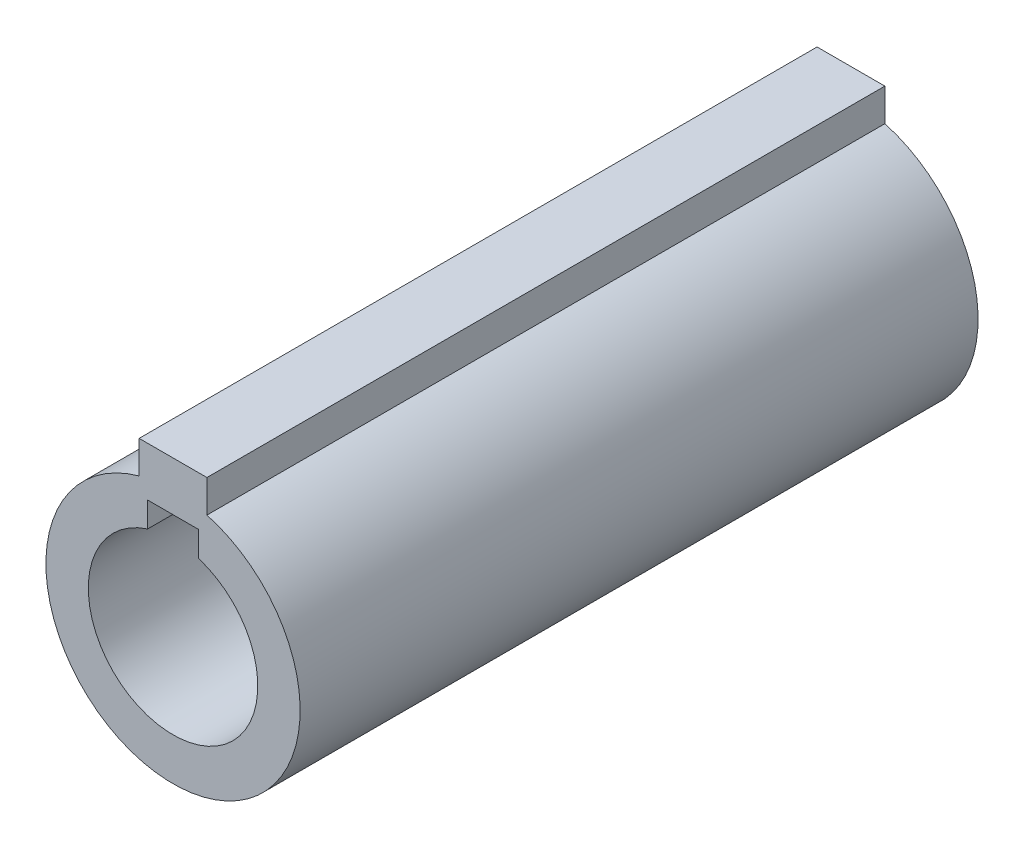
ISO-10303-21;
HEADER;
FILE_DESCRIPTION(('STEP AP214'),'2;1');
FILE_NAME('part.step','',(''),(''),'','','');
FILE_SCHEMA(('AUTOMOTIVE_DESIGN { 1 0 10303 214 1 1 1 1 }'));
ENDSEC;
DATA;
#1=APPLICATION_CONTEXT('core data for automotive mechanical design processes');
#2=APPLICATION_PROTOCOL_DEFINITION('international standard','automotive_design',2000,#1);
#3=PRODUCT_CONTEXT('',#1,'mechanical');
#4=PRODUCT('Part','Part','',(#3));
#5=PRODUCT_RELATED_PRODUCT_CATEGORY('part','',(#4));
#6=PRODUCT_DEFINITION_FORMATION('','',#4);
#7=PRODUCT_DEFINITION_CONTEXT('part definition',#1,'design');
#8=PRODUCT_DEFINITION('design','',#6,#7);
#9=PRODUCT_DEFINITION_SHAPE('','',#8);
#10=(LENGTH_UNIT() NAMED_UNIT(*) SI_UNIT(.MILLI.,.METRE.));
#11=(NAMED_UNIT(*) PLANE_ANGLE_UNIT() SI_UNIT($,.RADIAN.));
#12=(NAMED_UNIT(*) SI_UNIT($,.STERADIAN.) SOLID_ANGLE_UNIT());
#13=UNCERTAINTY_MEASURE_WITH_UNIT(LENGTH_MEASURE(1.E-05),#10,'distance_accuracy_value','');
#14=(GEOMETRIC_REPRESENTATION_CONTEXT(3) GLOBAL_UNCERTAINTY_ASSIGNED_CONTEXT((#13)) GLOBAL_UNIT_ASSIGNED_CONTEXT((#10,
#11,#12)) REPRESENTATION_CONTEXT('',''));
#15=CARTESIAN_POINT('',(0.,0.,0.));
#16=DIRECTION('',(0.,0.,1.));
#17=DIRECTION('',(1.,0.,0.));
#18=AXIS2_PLACEMENT_3D('',#15,#16,#17);
#19=CARTESIAN_POINT('',(0.,0.,80.));
#20=DIRECTION('',(0.,0.,1.));
#21=DIRECTION('',(1.,0.,0.));
#22=AXIS2_PLACEMENT_3D('',#19,#20,#21);
#23=PLANE('',#22);
#24=DIRECTION('',(-1.,0.,0.));
#25=VECTOR('',#24,1.);
#26=CARTESIAN_POINT('',(-4.,18.3,80.));
#27=LINE('',#26,#25);
#28=CARTESIAN_POINT('',(4.,18.3,80.));
#29=VERTEX_POINT('',#28);
#30=CARTESIAN_POINT('',(-4.,18.3,80.));
#31=VERTEX_POINT('',#30);
#32=EDGE_CURVE('E136',#29,#31,#27,.T.);
#33=ORIENTED_EDGE('',*,*,#32,.T.);
#34=DIRECTION('',(0.,-1.,0.));
#35=VECTOR('',#34,1.);
#36=CARTESIAN_POINT('',(-4.,18.3,80.));
#37=LINE('',#36,#35);
#38=CARTESIAN_POINT('',(-4.,14.456832294801,80.));
#39=VERTEX_POINT('',#38);
#40=EDGE_CURVE('E139',#31,#39,#37,.T.);
#41=ORIENTED_EDGE('',*,*,#40,.T.);
#42=CARTESIAN_POINT('',(0.,0.,80.));
#43=DIRECTION('',(0.,0.,1.));
#44=DIRECTION('',(1.,0.,0.));
#45=AXIS2_PLACEMENT_3D('',#42,#43,#44);
#46=CIRCLE('',#45,15.);
#47=CARTESIAN_POINT('',(4.,14.456832294801,80.));
#48=VERTEX_POINT('',#47);
#49=EDGE_CURVE('E142',#39,#48,#46,.T.);
#50=ORIENTED_EDGE('',*,*,#49,.T.);
#51=DIRECTION('',(0.,1.,0.));
#52=VECTOR('',#51,1.);
#53=CARTESIAN_POINT('',(4.,18.3,80.));
#54=LINE('',#53,#52);
#55=EDGE_CURVE('E144',#48,#29,#54,.T.);
#56=ORIENTED_EDGE('',*,*,#55,.T.);
#57=EDGE_LOOP('',(#33,#41,#50,#56));
#58=FACE_BOUND('',#57,.T.);
#59=DIRECTION('',(0.,1.,0.));
#60=VECTOR('',#59,1.);
#61=CARTESIAN_POINT('',(3.,12.5,80.));
#62=LINE('',#61,#60);
#63=CARTESIAN_POINT('',(3.,9.53939201416946,80.));
#64=VERTEX_POINT('',#63);
#65=CARTESIAN_POINT('',(3.,12.5,80.));
#66=VERTEX_POINT('',#65);
#67=EDGE_CURVE('E108',#64,#66,#62,.T.);
#68=ORIENTED_EDGE('',*,*,#67,.F.);
#69=CARTESIAN_POINT('',(0.,0.,80.));
#70=DIRECTION('',(0.,0.,1.));
#71=DIRECTION('',(1.,0.,0.));
#72=AXIS2_PLACEMENT_3D('',#69,#70,#71);
#73=CIRCLE('',#72,10.);
#74=CARTESIAN_POINT('',(-3.,9.53939201416946,80.));
#75=VERTEX_POINT('',#74);
#76=EDGE_CURVE('E100',#75,#64,#73,.T.);
#77=ORIENTED_EDGE('',*,*,#76,.F.);
#78=DIRECTION('',(0.,-1.,0.));
#79=VECTOR('',#78,1.);
#80=CARTESIAN_POINT('',(-3.,9.53939201416946,80.));
#81=LINE('',#80,#79);
#82=CARTESIAN_POINT('',(-3.,12.5,80.));
#83=VERTEX_POINT('',#82);
#84=EDGE_CURVE('E122',#83,#75,#81,.T.);
#85=ORIENTED_EDGE('',*,*,#84,.F.);
#86=DIRECTION('',(-1.,0.,0.));
#87=VECTOR('',#86,1.);
#88=CARTESIAN_POINT('',(-3.,12.5,80.));
#89=LINE('',#88,#87);
#90=EDGE_CURVE('E120',#66,#83,#89,.T.);
#91=ORIENTED_EDGE('',*,*,#90,.F.);
#92=EDGE_LOOP('',(#68,#77,#85,#91));
#93=FACE_BOUND('',#92,.T.);
#94=ADVANCED_FACE('F35',(#58,#93),#23,.T.);
#95=CARTESIAN_POINT('',(0.,0.,0.));
#96=DIRECTION('',(0.,0.,1.));
#97=DIRECTION('',(1.,0.,0.));
#98=AXIS2_PLACEMENT_3D('',#95,#96,#97);
#99=PLANE('',#98);
#100=DIRECTION('',(-1.,0.,0.));
#101=VECTOR('',#100,1.);
#102=CARTESIAN_POINT('',(-4.,18.3,0.));
#103=LINE('',#102,#101);
#104=CARTESIAN_POINT('',(4.,18.3,0.));
#105=VERTEX_POINT('',#104);
#106=CARTESIAN_POINT('',(-4.,18.3,0.));
#107=VERTEX_POINT('',#106);
#108=EDGE_CURVE('E116',#105,#107,#103,.T.);
#109=ORIENTED_EDGE('',*,*,#108,.F.);
#110=DIRECTION('',(0.,1.,0.));
#111=VECTOR('',#110,1.);
#112=CARTESIAN_POINT('',(4.,18.3,0.));
#113=LINE('',#112,#111);
#114=CARTESIAN_POINT('',(4.,14.456832294801,0.));
#115=VERTEX_POINT('',#114);
#116=EDGE_CURVE('E140',#115,#105,#113,.T.);
#117=ORIENTED_EDGE('',*,*,#116,.F.);
#118=CARTESIAN_POINT('',(0.,0.,0.));
#119=DIRECTION('',(0.,0.,1.));
#120=DIRECTION('',(1.,0.,0.));
#121=AXIS2_PLACEMENT_3D('',#118,#119,#120);
#122=CIRCLE('',#121,15.);
#123=CARTESIAN_POINT('',(-4.,14.456832294801,0.));
#124=VERTEX_POINT('',#123);
#125=EDGE_CURVE('E151',#124,#115,#122,.T.);
#126=ORIENTED_EDGE('',*,*,#125,.F.);
#127=DIRECTION('',(0.,-1.,0.));
#128=VECTOR('',#127,1.);
#129=CARTESIAN_POINT('',(-4.,18.3,0.));
#130=LINE('',#129,#128);
#131=EDGE_CURVE('E149',#107,#124,#130,.T.);
#132=ORIENTED_EDGE('',*,*,#131,.F.);
#133=EDGE_LOOP('',(#109,#117,#126,#132));
#134=FACE_BOUND('',#133,.T.);
#135=CARTESIAN_POINT('',(0.,0.,0.));
#136=DIRECTION('',(0.,0.,1.));
#137=DIRECTION('',(1.,0.,0.));
#138=AXIS2_PLACEMENT_3D('',#135,#136,#137);
#139=CIRCLE('',#138,10.);
#140=CARTESIAN_POINT('',(-3.,9.53939201416946,0.));
#141=VERTEX_POINT('',#140);
#142=CARTESIAN_POINT('',(3.,9.53939201416946,0.));
#143=VERTEX_POINT('',#142);
#144=EDGE_CURVE('E58',#141,#143,#139,.T.);
#145=ORIENTED_EDGE('',*,*,#144,.T.);
#146=DIRECTION('',(0.,1.,0.));
#147=VECTOR('',#146,1.);
#148=CARTESIAN_POINT('',(3.,12.5,0.));
#149=LINE('',#148,#147);
#150=CARTESIAN_POINT('',(3.,12.5,0.));
#151=VERTEX_POINT('',#150);
#152=EDGE_CURVE('E115',#143,#151,#149,.T.);
#153=ORIENTED_EDGE('',*,*,#152,.T.);
#154=DIRECTION('',(-1.,0.,0.));
#155=VECTOR('',#154,1.);
#156=CARTESIAN_POINT('',(-3.,12.5,0.));
#157=LINE('',#156,#155);
#158=CARTESIAN_POINT('',(-3.,12.5,0.));
#159=VERTEX_POINT('',#158);
#160=EDGE_CURVE('E128',#151,#159,#157,.T.);
#161=ORIENTED_EDGE('',*,*,#160,.T.);
#162=DIRECTION('',(0.,-1.,0.));
#163=VECTOR('',#162,1.);
#164=CARTESIAN_POINT('',(-3.,9.53939201416946,0.));
#165=LINE('',#164,#163);
#166=EDGE_CURVE('E109',#159,#141,#165,.T.);
#167=ORIENTED_EDGE('',*,*,#166,.T.);
#168=EDGE_LOOP('',(#145,#153,#161,#167));
#169=FACE_BOUND('',#168,.T.);
#170=ADVANCED_FACE('F169',(#134,#169),#99,.F.);
#171=CARTESIAN_POINT('',(-4.,18.3,80.));
#172=DIRECTION('',(0.,-1.,0.));
#173=DIRECTION('',(0.,0.,-1.));
#174=AXIS2_PLACEMENT_3D('',#171,#172,#173);
#175=PLANE('',#174);
#176=ORIENTED_EDGE('',*,*,#108,.T.);
#177=DIRECTION('',(0.,0.,-1.));
#178=VECTOR('',#177,1.);
#179=CARTESIAN_POINT('',(-4.,18.3,80.));
#180=LINE('',#179,#178);
#181=EDGE_CURVE('E11',#31,#107,#180,.T.);
#182=ORIENTED_EDGE('',*,*,#181,.F.);
#183=ORIENTED_EDGE('',*,*,#32,.F.);
#184=DIRECTION('',(0.,0.,-1.));
#185=VECTOR('',#184,1.);
#186=CARTESIAN_POINT('',(4.,18.3,80.));
#187=LINE('',#186,#185);
#188=EDGE_CURVE('E146',#29,#105,#187,.T.);
#189=ORIENTED_EDGE('',*,*,#188,.T.);
#190=EDGE_LOOP('',(#176,#182,#183,#189));
#191=FACE_BOUND('',#190,.T.);
#192=ADVANCED_FACE('F37',(#191),#175,.F.);
#193=CARTESIAN_POINT('',(-4.,18.3,80.));
#194=DIRECTION('',(1.,0.,0.));
#195=DIRECTION('',(0.,1.,0.));
#196=AXIS2_PLACEMENT_3D('',#193,#194,#195);
#197=PLANE('',#196);
#198=ORIENTED_EDGE('',*,*,#131,.T.);
#199=DIRECTION('',(0.,0.,-1.));
#200=VECTOR('',#199,1.);
#201=CARTESIAN_POINT('',(-4.,14.456832294801,80.));
#202=LINE('',#201,#200);
#203=EDGE_CURVE('E43',#39,#124,#202,.T.);
#204=ORIENTED_EDGE('',*,*,#203,.F.);
#205=ORIENTED_EDGE('',*,*,#40,.F.);
#206=ORIENTED_EDGE('',*,*,#181,.T.);
#207=EDGE_LOOP('',(#198,#204,#205,#206));
#208=FACE_BOUND('',#207,.T.);
#209=ADVANCED_FACE('F179',(#208),#197,.F.);
#210=CARTESIAN_POINT('',(0.,0.,80.));
#211=DIRECTION('',(0.,0.,-1.));
#212=DIRECTION('',(-1.,0.,0.));
#213=AXIS2_PLACEMENT_3D('',#210,#211,#212);
#214=CYLINDRICAL_SURFACE('',#213,15.);
#215=ORIENTED_EDGE('',*,*,#125,.T.);
#216=DIRECTION('',(0.,0.,-1.));
#217=VECTOR('',#216,1.);
#218=CARTESIAN_POINT('',(4.,14.456832294801,80.));
#219=LINE('',#218,#217);
#220=EDGE_CURVE('E156',#48,#115,#219,.T.);
#221=ORIENTED_EDGE('',*,*,#220,.F.);
#222=ORIENTED_EDGE('',*,*,#49,.F.);
#223=ORIENTED_EDGE('',*,*,#203,.T.);
#224=EDGE_LOOP('',(#215,#221,#222,#223));
#225=FACE_BOUND('',#224,.T.);
#226=ADVANCED_FACE('F163',(#225),#214,.T.);
#227=CARTESIAN_POINT('',(4.,18.3,80.));
#228=DIRECTION('',(-1.,0.,0.));
#229=DIRECTION('',(0.,-1.,0.));
#230=AXIS2_PLACEMENT_3D('',#227,#228,#229);
#231=PLANE('',#230);
#232=ORIENTED_EDGE('',*,*,#116,.T.);
#233=ORIENTED_EDGE('',*,*,#188,.F.);
#234=ORIENTED_EDGE('',*,*,#55,.F.);
#235=ORIENTED_EDGE('',*,*,#220,.T.);
#236=EDGE_LOOP('',(#232,#233,#234,#235));
#237=FACE_BOUND('',#236,.T.);
#238=ADVANCED_FACE('F173',(#237),#231,.F.);
#239=CARTESIAN_POINT('',(0.,0.,80.));
#240=DIRECTION('',(0.,0.,-1.));
#241=DIRECTION('',(-1.,0.,0.));
#242=AXIS2_PLACEMENT_3D('',#239,#240,#241);
#243=CYLINDRICAL_SURFACE('',#242,10.);
#244=ORIENTED_EDGE('',*,*,#144,.F.);
#245=DIRECTION('',(0.,0.,-1.));
#246=VECTOR('',#245,1.);
#247=CARTESIAN_POINT('',(-3.,9.53939201416946,80.));
#248=LINE('',#247,#246);
#249=EDGE_CURVE('E104',#75,#141,#248,.T.);
#250=ORIENTED_EDGE('',*,*,#249,.F.);
#251=ORIENTED_EDGE('',*,*,#76,.T.);
#252=DIRECTION('',(0.,0.,-1.));
#253=VECTOR('',#252,1.);
#254=CARTESIAN_POINT('',(3.,9.53939201416946,80.));
#255=LINE('',#254,#253);
#256=EDGE_CURVE('E103',#64,#143,#255,.T.);
#257=ORIENTED_EDGE('',*,*,#256,.T.);
#258=EDGE_LOOP('',(#244,#250,#251,#257));
#259=FACE_BOUND('',#258,.T.);
#260=ADVANCED_FACE('F102',(#259),#243,.F.);
#261=CARTESIAN_POINT('',(3.,12.5,80.));
#262=DIRECTION('',(-1.,0.,0.));
#263=DIRECTION('',(0.,0.,1.));
#264=AXIS2_PLACEMENT_3D('',#261,#262,#263);
#265=PLANE('',#264);
#266=ORIENTED_EDGE('',*,*,#152,.F.);
#267=ORIENTED_EDGE('',*,*,#256,.F.);
#268=ORIENTED_EDGE('',*,*,#67,.T.);
#269=DIRECTION('',(0.,0.,-1.));
#270=VECTOR('',#269,1.);
#271=CARTESIAN_POINT('',(3.,12.5,80.));
#272=LINE('',#271,#270);
#273=EDGE_CURVE('E117',#66,#151,#272,.T.);
#274=ORIENTED_EDGE('',*,*,#273,.T.);
#275=EDGE_LOOP('',(#266,#267,#268,#274));
#276=FACE_BOUND('',#275,.T.);
#277=ADVANCED_FACE('F112',(#276),#265,.T.);
#278=CARTESIAN_POINT('',(-3.,12.5,80.));
#279=DIRECTION('',(0.,-1.,0.));
#280=DIRECTION('',(0.,0.,-1.));
#281=AXIS2_PLACEMENT_3D('',#278,#279,#280);
#282=PLANE('',#281);
#283=ORIENTED_EDGE('',*,*,#160,.F.);
#284=ORIENTED_EDGE('',*,*,#273,.F.);
#285=ORIENTED_EDGE('',*,*,#90,.T.);
#286=DIRECTION('',(0.,0.,-1.));
#287=VECTOR('',#286,1.);
#288=CARTESIAN_POINT('',(-3.,12.5,80.));
#289=LINE('',#288,#287);
#290=EDGE_CURVE('E50',#83,#159,#289,.T.);
#291=ORIENTED_EDGE('',*,*,#290,.T.);
#292=EDGE_LOOP('',(#283,#284,#285,#291));
#293=FACE_BOUND('',#292,.T.);
#294=ADVANCED_FACE('F202',(#293),#282,.T.);
#295=CARTESIAN_POINT('',(-3.,9.53939201416946,80.));
#296=DIRECTION('',(1.,0.,0.));
#297=DIRECTION('',(0.,1.,0.));
#298=AXIS2_PLACEMENT_3D('',#295,#296,#297);
#299=PLANE('',#298);
#300=ORIENTED_EDGE('',*,*,#166,.F.);
#301=ORIENTED_EDGE('',*,*,#290,.F.);
#302=ORIENTED_EDGE('',*,*,#84,.T.);
#303=ORIENTED_EDGE('',*,*,#249,.T.);
#304=EDGE_LOOP('',(#300,#301,#302,#303));
#305=FACE_BOUND('',#304,.T.);
#306=ADVANCED_FACE('F206',(#305),#299,.T.);
#307=CLOSED_SHELL('',(#94,#170,#192,#209,#226,#238,#260,#277,#294,#306));
#308=MANIFOLD_SOLID_BREP('B2',#307);
#309=ADVANCED_BREP_SHAPE_REPRESENTATION('',(#18,#308),#14);
#310=SHAPE_DEFINITION_REPRESENTATION(#9,#309);
ENDSEC;
END-ISO-10303-21;
